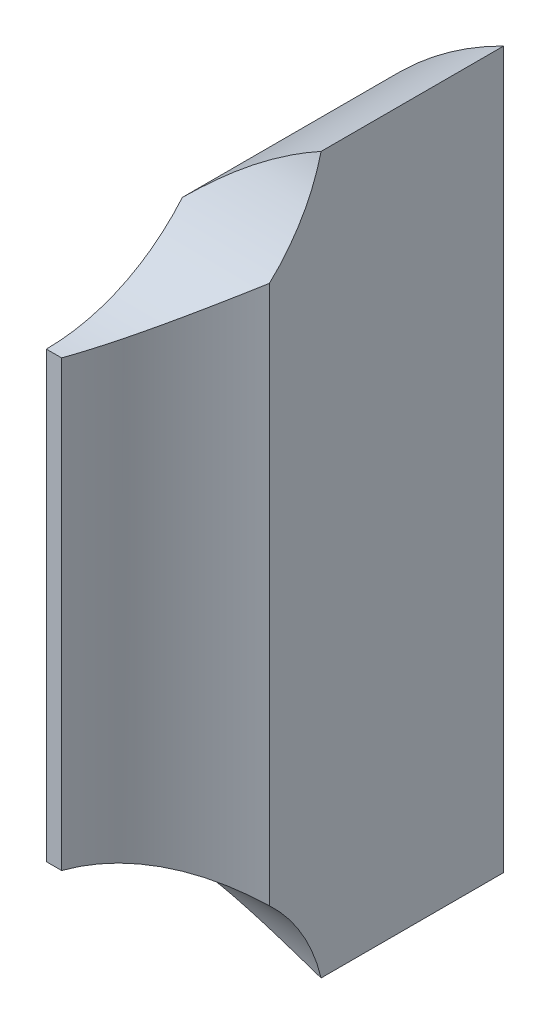
ISO-10303-21;
HEADER;
FILE_DESCRIPTION(('STEP AP214'),'2;1');
FILE_NAME('part.step','',(''),(''),'','','');
FILE_SCHEMA(('AUTOMOTIVE_DESIGN { 1 0 10303 214 1 1 1 1 }'));
ENDSEC;
DATA;
#1=APPLICATION_CONTEXT('core data for automotive mechanical design processes');
#2=APPLICATION_PROTOCOL_DEFINITION('international standard','automotive_design',2000,#1);
#3=PRODUCT_CONTEXT('',#1,'mechanical');
#4=PRODUCT('Part','Part','',(#3));
#5=PRODUCT_RELATED_PRODUCT_CATEGORY('part','',(#4));
#6=PRODUCT_DEFINITION_FORMATION('','',#4);
#7=PRODUCT_DEFINITION_CONTEXT('part definition',#1,'design');
#8=PRODUCT_DEFINITION('design','',#6,#7);
#9=PRODUCT_DEFINITION_SHAPE('','',#8);
#10=(LENGTH_UNIT() NAMED_UNIT(*) SI_UNIT(.MILLI.,.METRE.));
#11=(NAMED_UNIT(*) PLANE_ANGLE_UNIT() SI_UNIT($,.RADIAN.));
#12=(NAMED_UNIT(*) SI_UNIT($,.STERADIAN.) SOLID_ANGLE_UNIT());
#13=UNCERTAINTY_MEASURE_WITH_UNIT(LENGTH_MEASURE(1.E-05),#10,'distance_accuracy_value','');
#14=(GEOMETRIC_REPRESENTATION_CONTEXT(3) GLOBAL_UNCERTAINTY_ASSIGNED_CONTEXT((#13)) GLOBAL_UNIT_ASSIGNED_CONTEXT((#10,
#11,#12)) REPRESENTATION_CONTEXT('',''));
#15=CARTESIAN_POINT('',(0.,0.,0.));
#16=DIRECTION('',(0.,0.,1.));
#17=DIRECTION('',(1.,0.,0.));
#18=AXIS2_PLACEMENT_3D('',#15,#16,#17);
#19=CARTESIAN_POINT('',(-0.9525,-103.07574,-15.3797));
#20=DIRECTION('',(0.,1.,0.));
#21=DIRECTION('',(0.,0.,-1.));
#22=AXIS2_PLACEMENT_3D('',#19,#20,#21);
#23=CYLINDRICAL_SURFACE('',#22,19.05);
#24=CARTESIAN_POINT('',(-18.9130122421383,-15.875,-21.7297000000001));
#25=CARTESIAN_POINT('',(-18.8811903085846,-15.8749565257701,-21.8197073793476));
#26=CARTESIAN_POINT('',(-18.8486910774269,-15.8758817859889,-21.9094748735233));
#27=CARTESIAN_POINT('',(-18.7823799833486,-15.8796309678191,-22.0884237788564));
#28=CARTESIAN_POINT('',(-18.7485689055275,-15.882453769835,-22.177605504318));
#29=CARTESIAN_POINT('',(-18.6796530652591,-15.8899576811454,-22.3553452657174));
#30=CARTESIAN_POINT('',(-18.6445488551965,-15.8946380051287,-22.4439035491481));
#31=CARTESIAN_POINT('',(-18.5730674405112,-15.9058162758002,-22.620360321333));
#32=CARTESIAN_POINT('',(-18.5366905933085,-15.9123137156807,-22.7082589870506));
#33=CARTESIAN_POINT('',(-18.4626857676108,-15.9270856930541,-22.8833609357504));
#34=CARTESIAN_POINT('',(-18.4250579876532,-15.9353599496729,-22.9705643263825));
#35=CARTESIAN_POINT('',(-18.3485744539755,-15.9536450593197,-23.1442409646096));
#36=CARTESIAN_POINT('',(-18.3097187738075,-15.9636558084912,-23.2307142555465));
#37=CARTESIAN_POINT('',(-18.2308038257921,-15.9853734576285,-23.4028967249284));
#38=CARTESIAN_POINT('',(-18.1907445381315,-15.9970803855282,-23.4886058907646));
#39=CARTESIAN_POINT('',(-18.109447972262,-16.022149988871,-23.6592269865126));
#40=CARTESIAN_POINT('',(-18.0682106101074,-16.0355127825331,-23.7441388590363));
#41=CARTESIAN_POINT('',(-17.9845846712323,-16.0638537553766,-23.913133120116));
#42=CARTESIAN_POINT('',(-17.9421959732239,-16.0788321052469,-23.9972154199984));
#43=CARTESIAN_POINT('',(-17.8562952874208,-16.1103638650926,-24.1645191982283));
#44=CARTESIAN_POINT('',(-17.8127831653231,-16.1269174640271,-24.2477405719725));
#45=CARTESIAN_POINT('',(-17.7246646727195,-16.1615594306812,-24.4132921027716));
#46=CARTESIAN_POINT('',(-17.6800581767721,-16.1796479749323,-24.4956221560863));
#47=CARTESIAN_POINT('',(-17.5897810606403,-16.2173195680827,-24.6593616254006));
#48=CARTESIAN_POINT('',(-17.5441103433419,-16.2369027537476,-24.7407709563661));
#49=CARTESIAN_POINT('',(-17.4517359584641,-16.2775234020796,-24.902640562119));
#50=CARTESIAN_POINT('',(-17.4050322392149,-16.2985609376045,-24.983100789123));
#51=CARTESIAN_POINT('',(-17.3106240321332,-16.3420500442234,-25.1430448085102));
#52=CARTESIAN_POINT('',(-17.2629195529226,-16.3645016031385,-25.2225286092964));
#53=CARTESIAN_POINT('',(-17.1665429421,-16.4107787027458,-25.3804935250299));
#54=CARTESIAN_POINT('',(-17.1178708908745,-16.4346041296064,-25.4589747223914));
#55=CARTESIAN_POINT('',(-17.0195900094295,-16.4835898943191,-25.6149143017133));
#56=CARTESIAN_POINT('',(-16.9699812826543,-16.5087500853117,-25.6923727950318));
#57=CARTESIAN_POINT('',(-16.869853699063,-16.5603672197415,-25.8462551668177));
#58=CARTESIAN_POINT('',(-16.8193348976952,-16.5868240843438,-25.922679107824));
#59=CARTESIAN_POINT('',(-16.7174136095199,-16.6409967564092,-26.0744817528764));
#60=CARTESIAN_POINT('',(-16.6660111403802,-16.6687125387202,-26.1498604777659));
#61=CARTESIAN_POINT('',(-16.562349060684,-16.7253652161715,-26.2995627060482));
#62=CARTESIAN_POINT('',(-16.5100894452958,-16.7543021181967,-26.3738862034884));
#63=CARTESIAN_POINT('',(-16.4047397091269,-16.8133592375,-26.5214686169733));
#64=CARTESIAN_POINT('',(-16.3516495745938,-16.8434794743851,-26.5947275153509));
#65=CARTESIAN_POINT('',(-16.2446655129385,-16.9048654828064,-26.7401719962394));
#66=CARTESIAN_POINT('',(-16.1907715751204,-16.936131269594,-26.8123575644425));
#67=CARTESIAN_POINT('',(-16.0822066799392,-16.9997706093167,-26.955647275926));
#68=CARTESIAN_POINT('',(-16.0275357254176,-17.0321441582014,-27.0267514231591));
#69=CARTESIAN_POINT('',(-15.9174436269496,-17.0979612873976,-27.1678707970239));
#70=CARTESIAN_POINT('',(-15.8620225084752,-17.1314048314294,-27.2378860604562));
#71=CARTESIAN_POINT('',(-15.7504561019691,-17.1993246500139,-27.3768218312904));
#72=CARTESIAN_POINT('',(-15.6943108592628,-17.2338008601055,-27.4457424066156));
#73=CARTESIAN_POINT('',(-15.5813197112552,-17.3037554290029,-27.5824865698752));
#74=CARTESIAN_POINT('',(-15.5244738331652,-17.3392337489575,-27.6503102001775));
#75=CARTESIAN_POINT('',(-15.4101037389161,-17.411162603415,-27.7848598179297));
#76=CARTESIAN_POINT('',(-15.3525795282241,-17.4476131300854,-27.8515858142155));
#77=CARTESIAN_POINT('',(-15.2368748019826,-17.5214564534876,-27.9839398789271));
#78=CARTESIAN_POINT('',(-15.1786942781031,-17.5588492621864,-28.0495679333914));
#79=CARTESIAN_POINT('',(-15.0616986782519,-17.6345472229249,-28.1797261772827));
#80=CARTESIAN_POINT('',(-15.002883587174,-17.6728523967103,-28.2442563404791));
#81=CARTESIAN_POINT('',(-14.8846403188259,-17.7503451656461,-28.372219206654));
#82=CARTESIAN_POINT('',(-14.8252121258389,-17.7895327834485,-28.4356518813863));
#83=CARTESIAN_POINT('',(-14.705763838086,-17.8687605400325,-28.5614205009087));
#84=CARTESIAN_POINT('',(-14.6457437323743,-17.9088006945953,-28.6237564253578));
#85=CARTESIAN_POINT('',(-14.5251324986375,-17.9897035847125,-28.7473326107621));
#86=CARTESIAN_POINT('',(-14.4645413691049,-18.0305663224391,-28.8085728688231));
#87=CARTESIAN_POINT('',(-14.3428087433889,-18.113084620717,-28.9299590376117));
#88=CARTESIAN_POINT('',(-14.2816672591563,-18.1547401640746,-28.990104972017));
#89=CARTESIAN_POINT('',(-14.1588538200501,-18.2388138229969,-29.1093045571513));
#90=CARTESIAN_POINT('',(-14.0971818920518,-18.2812319000447,-29.1683582627467));
#91=CARTESIAN_POINT('',(-13.9733260767724,-18.3668061657855,-29.2853767668838));
#92=CARTESIAN_POINT('',(-13.9111422129951,-18.4099623206892,-29.3433416150201));
#93=CARTESIAN_POINT('',(-13.7862797439973,-18.4969910752837,-29.4581868632616));
#94=CARTESIAN_POINT('',(-13.7236011496527,-18.5408636592476,-29.5150672871126));
#95=CARTESIAN_POINT('',(-13.5977658424902,-18.6293031946993,-29.6277484502632));
#96=CARTESIAN_POINT('',(-13.5346091314516,-18.6738701436038,-29.6835491935778));
#97=CARTESIAN_POINT('',(-13.4078338505143,-18.7636764511526,-29.7940758373117));
#98=CARTESIAN_POINT('',(-13.3442152765825,-18.8089158156721,-29.8488017283296));
#99=CARTESIAN_POINT('',(-13.2165321013326,-18.9000449751057,-29.957183634436));
#100=CARTESIAN_POINT('',(-13.152467493057,-18.9459347801774,-30.0108396327849));
#101=CARTESIAN_POINT('',(-13.0239077383455,-19.0383428354514,-30.1170867922243));
#102=CARTESIAN_POINT('',(-12.9594125845558,-19.0848610964019,-30.1696779350645));
#103=CARTESIAN_POINT('',(-12.8300066430001,-19.1785041477027,-30.273800594719));
#104=CARTESIAN_POINT('',(-12.7650958496821,-19.2256289461635,-30.3253320973399));
#105=CARTESIAN_POINT('',(-12.6999850092901,-19.2730458172475,-30.3763361547016));
#106=B_SPLINE_CURVE_WITH_KNOTS('',3,(#24,#25,#26,#27,#28,#29,#30,#31,#32,#33,#34,#35,#36,#37,
#38,#39,#40,#41,#42,#43,#44,#45,#46,#47,#48,#49,#50,#51,#52,#53,#54,#55,#56,#57,#58,#59,#60,#61,
#62,#63,#64,#65,#66,#67,#68,#69,#70,#71,#72,#73,#74,#75,#76,#77,#78,#79,#80,#81,#82,#83,#84,#85,
#86,#87,#88,#89,#90,#91,#92,#93,#94,#95,#96,#97,#98,#99,#100,#101,#102,#103,#104,#105),
.UNSPECIFIED.,.F.,.F.,(4,2,2,2,2,2,2,2,2,2,2,2,2,2,2,2,2,2,2,2,2,2,2,2,2,2,2,2,2,2,2,2,2,2,2,2,
2,2,2,2,4),(0.,0.286392426901371,0.572616023479862,0.858718740951261,1.14474174160438,
1.43071956181754,1.71668028409115,2.00264571630182,2.2886315765028,2.57464768172405,
2.8606981393582,3.14678153985418,3.43289114957385,3.71901510279806,4.00513659199418,
4.29123440861882,4.57730081194722,4.86334984459554,5.14939316473261,5.43543809785371,
5.7214877725344,6.00754125695709,6.29359369559218,6.57963644548234,6.8656613770143,
7.15167523468843,7.43768678880847,7.72370197710865,8.00972398924607,8.29575335184787,
8.58178801372538,8.86782343101232,9.15385265201156,9.43986746553786,9.72586922009848,
10.0118647047948,10.2978591257361,10.5838560470405,10.869857439532,11.1558637295909,
11.4418738480667),.UNSPECIFIED.);
#107=CARTESIAN_POINT('',(-18.9130122421383,-15.875,-21.7297));
#108=VERTEX_POINT('',#107);
#109=CARTESIAN_POINT('',(-12.6999999991116,-19.2730649975569,-30.3763374629023));
#110=VERTEX_POINT('',#109);
#111=EDGE_CURVE('E115',#108,#110,#106,.T.);
#112=ORIENTED_EDGE('',*,*,#111,.T.);
#113=DIRECTION('',(0.,1.,0.));
#114=VECTOR('',#113,1.);
#115=CARTESIAN_POINT('',(-12.7,-103.07574,-30.3763244118468));
#116=LINE('',#115,#114);
#117=CARTESIAN_POINT('',(-12.6999999968803,19.2730800463632,-30.3763439893252));
#118=VERTEX_POINT('',#117);
#119=EDGE_CURVE('E102',#110,#118,#116,.T.);
#120=ORIENTED_EDGE('',*,*,#119,.T.);
#121=CARTESIAN_POINT('',(-12.6999850039393,19.2730458211441,-30.3763361588931));
#122=CARTESIAN_POINT('',(-12.7650958443869,19.2256289500116,-30.3253321015254));
#123=CARTESIAN_POINT('',(-12.8300066377604,19.1785041515024,-30.2738005988977));
#124=CARTESIAN_POINT('',(-12.9594125794268,19.0848611001051,-30.1696779392286));
#125=CARTESIAN_POINT('',(-13.0239077332719,19.0383428391064,-30.1170867963804));
#126=CARTESIAN_POINT('',(-13.1524674880939,18.9459347837365,-30.0108396369236));
#127=CARTESIAN_POINT('',(-13.2165320964246,18.9000449786169,-29.9571836385654));
#128=CARTESIAN_POINT('',(-13.3442152717845,18.8089158190879,-29.848801732439));
#129=CARTESIAN_POINT('',(-13.4078338457712,18.7636764545209,-29.7940758414104));
#130=CARTESIAN_POINT('',(-13.5346091268181,18.6738701468775,-29.6835491976539));
#131=CARTESIAN_POINT('',(-13.5977658379114,18.6293031979258,-29.6277484543272));
#132=CARTESIAN_POINT('',(-13.723601145183,18.5408636623803,-29.5150672911512));
#133=CARTESIAN_POINT('',(-13.7862797395821,18.4969910783697,-29.4581868672868));
#134=CARTESIAN_POINT('',(-13.9111422086884,18.4099623236822,-29.3433416190172));
#135=CARTESIAN_POINT('',(-13.9733260725198,18.3668061687323,-29.285376770866));
#136=CARTESIAN_POINT('',(-14.0971818879071,18.2812319028995,-29.168358266698));
#137=CARTESIAN_POINT('',(-14.1588538159593,18.238813825806,-29.1093045610865));
#138=CARTESIAN_POINT('',(-14.2816672551729,18.1547401667926,-28.9901049759185));
#139=CARTESIAN_POINT('',(-14.342808739459,18.1130846233898,-28.9299590414955));
#140=CARTESIAN_POINT('',(-14.4645413652818,18.0305663250217,-28.8085728726702));
#141=CARTESIAN_POINT('',(-14.5251324948676,17.9897035872503,-28.7473326145902));
#142=CARTESIAN_POINT('',(-14.6457437287104,17.9088006970438,-28.6237564291463));
#143=CARTESIAN_POINT('',(-14.705763834475,17.8687605424367,-28.5614205046766));
#144=CARTESIAN_POINT('',(-14.8252121223332,17.7895327857647,-28.4356518851117));
#145=CARTESIAN_POINT('',(-14.8846403153726,17.7503451679185,-28.3722192103574));
#146=CARTESIAN_POINT('',(-15.0028835838252,17.6728523988958,-28.2442563441369));
#147=CARTESIAN_POINT('',(-15.0616986749552,17.6345472250673,-28.179726180917));
#148=CARTESIAN_POINT('',(-15.17869427491,17.5588492642432,-28.0495679369771));
#149=CARTESIAN_POINT('',(-15.236874798841,17.5214564555019,-27.9839398824879));
#150=CARTESIAN_POINT('',(-15.3525795251851,17.4476131320156,-27.8515858177247));
#151=CARTESIAN_POINT('',(-15.4101037359282,17.4111626053036,-27.7848598214123));
#152=CARTESIAN_POINT('',(-15.5244738302788,17.3392337507635,-27.6503102036056));
#153=CARTESIAN_POINT('',(-15.5813197084193,17.303755430768,-27.5824865732752));
#154=CARTESIAN_POINT('',(-15.6943108565274,17.2338008617898,-27.4457424099581));
#155=CARTESIAN_POINT('',(-15.7504560992836,17.1993246516584,-27.3768218346033));
#156=CARTESIAN_POINT('',(-15.8620225058889,17.1314048329947,-27.2378860637085));
#157=CARTESIAN_POINT('',(-15.9174436244126,17.0979612889238,-27.167870800245));
#158=CARTESIAN_POINT('',(-16.0275357229786,17.0321441596504,-27.0267514263164));
#159=CARTESIAN_POINT('',(-16.0822066775489,16.9997706107274,-26.9556472790506));
#160=CARTESIAN_POINT('',(-16.1907715728268,16.9361312709293,-26.8123575675));
#161=CARTESIAN_POINT('',(-16.2446655106929,16.9048654841045,-26.7401719992626));
#162=CARTESIAN_POINT('',(-16.3516495724435,16.8434794756098,-26.5947275183039));
#163=CARTESIAN_POINT('',(-16.4047397070238,16.8133592386886,-26.5214686198905));
#164=CARTESIAN_POINT('',(-16.5100894432865,16.754302119314,-26.3738862063322));
#165=CARTESIAN_POINT('',(-16.5623490587211,16.7253652172538,-26.2995627088545));
#166=CARTESIAN_POINT('',(-16.6660111385095,16.6687125397335,-26.1498604804957));
#167=CARTESIAN_POINT('',(-16.7174136076948,16.6409967573887,-26.0744817555672));
#168=CARTESIAN_POINT('',(-16.8193348959605,16.5868240852569,-25.9226791104352));
#169=CARTESIAN_POINT('',(-16.8698536973731,16.5603672206221,-25.8462551693883));
#170=CARTESIAN_POINT('',(-16.9699812810529,16.5087500861285,-25.6923727975196));
#171=CARTESIAN_POINT('',(-17.0195900078718,16.4835898951046,-25.6149143041591));
#172=CARTESIAN_POINT('',(-17.1178708894034,16.434604130331,-25.4589747247513));
#173=CARTESIAN_POINT('',(-17.1665429406717,16.4107787034406,-25.3804935273461));
#174=CARTESIAN_POINT('',(-17.2629195515788,16.3645016037753,-25.2225286115237));
#175=CARTESIAN_POINT('',(-17.3106240308312,16.3420500448319,-25.1430448106922));
#176=CARTESIAN_POINT('',(-17.4050322379954,16.298560938158,-24.9831007912128));
#177=CARTESIAN_POINT('',(-17.4517359572853,16.2775234026064,-24.902640564162));
#178=CARTESIAN_POINT('',(-17.5441103422433,16.2369027542227,-24.7407709583138));
#179=CARTESIAN_POINT('',(-17.5897810595813,16.2173195685327,-24.6593616273));
#180=CARTESIAN_POINT('',(-17.6800581757908,16.179647975334,-24.4956221578874));
#181=CARTESIAN_POINT('',(-17.7246646717766,16.1615594310596,-24.4132921045229));
#182=CARTESIAN_POINT('',(-17.8127831644556,16.1269174643607,-24.2477405736226));
#183=CARTESIAN_POINT('',(-17.8562952865903,16.1103638654048,-24.1645191998271));
#184=CARTESIAN_POINT('',(-17.942195972466,16.078832105518,-23.9972154214933));
#185=CARTESIAN_POINT('',(-17.9845846705101,16.0638537556282,-23.9131331215581));
#186=CARTESIAN_POINT('',(-18.0682106094551,16.0355127827476,-23.7441388603719));
#187=CARTESIAN_POINT('',(-18.1094479716439,16.0221499890679,-23.6592269877942));
#188=CARTESIAN_POINT('',(-18.1907445375804,15.997080385692,-23.488605891937));
#189=CARTESIAN_POINT('',(-18.2308038252737,15.9853734577768,-23.4028967260455));
#190=CARTESIAN_POINT('',(-18.309718773353,15.9636558086107,-23.230714256552));
#191=CARTESIAN_POINT('',(-18.3485744535522,15.9536450594258,-23.1442409655587));
#192=CARTESIAN_POINT('',(-18.4250579872907,15.9353599497546,-22.9705643272176));
#193=CARTESIAN_POINT('',(-18.4626857672779,15.9270856931247,-22.883360936528));
#194=CARTESIAN_POINT('',(-18.5366905930332,15.9123137157315,-22.7082589877121));
#195=CARTESIAN_POINT('',(-18.5730674402638,15.9058162758421,-22.6203603219359));
#196=CARTESIAN_POINT('',(-18.6445488550033,15.8946380051555,-22.4439035496329));
#197=CARTESIAN_POINT('',(-18.6796530650921,15.8899576811659,-22.3553452661426));
#198=CARTESIAN_POINT('',(-18.7485689054112,15.8824537698452,-22.1776055046232));
#199=CARTESIAN_POINT('',(-18.7823799832568,15.8796309678255,-22.0884237791011));
#200=CARTESIAN_POINT('',(-18.8486910773824,15.8758817859901,-21.9094748736462));
#201=CARTESIAN_POINT('',(-18.8811903085628,15.87495652577,-21.8197073794092));
#202=CARTESIAN_POINT('',(-18.9130122421383,15.875,-21.7297000000001));
#203=B_SPLINE_CURVE_WITH_KNOTS('',3,(#121,#122,#123,#124,#125,#126,#127,#128,#129,#130,#131,
#132,#133,#134,#135,#136,#137,#138,#139,#140,#141,#142,#143,#144,#145,#146,#147,#148,#149,#150,
#151,#152,#153,#154,#155,#156,#157,#158,#159,#160,#161,#162,#163,#164,#165,#166,#167,#168,#169,
#170,#171,#172,#173,#174,#175,#176,#177,#178,#179,#180,#181,#182,#183,#184,#185,#186,#187,#188,
#189,#190,#191,#192,#193,#194,#195,#196,#197,#198,#199,#200,#201,#202),.UNSPECIFIED.,.F.,.F.,(4,
2,2,2,2,2,2,2,2,2,2,2,2,2,2,2,2,2,2,2,2,2,2,2,2,2,2,2,2,2,2,2,2,2,2,2,2,2,2,2,4),(0.,
0.286010118671753,0.572016408926673,0.858017801614147,1.14401472311451,1.4300091442517,
1.71600462914377,2.00200638390004,2.28802119762184,2.57405041881673,2.86008583629949,
3.14612049837294,3.43214986117075,3.71817187350416,4.00418706200031,4.29019861631622,
4.57621247418611,4.86223740591365,5.14828015599946,5.43433259483036,5.72038607944897,
6.0064357543256,6.29248068764264,6.57852400797556,6.86457304081964,7.15063944434368,
7.43673726116391,7.72285875055584,8.00898270397606,8.2950923138918,8.58117571458391,
8.86722617241417,9.15324227783147,9.43922813822843,9.72519357063499,10.0111542931044,
10.2971321135133,10.5831551143622,10.8692578320293,11.1554814288037,11.4418738559012),.UNSPECIFIED.);
#204=CARTESIAN_POINT('',(-18.9130122421383,15.875,-21.7297));
#205=VERTEX_POINT('',#204);
#206=EDGE_CURVE('E111',#118,#205,#203,.T.);
#207=ORIENTED_EDGE('',*,*,#206,.T.);
#208=DIRECTION('',(0.,1.,0.));
#209=VECTOR('',#208,1.);
#210=CARTESIAN_POINT('',(-18.9130122421383,-103.07574,-21.7297));
#211=LINE('',#210,#209);
#212=EDGE_CURVE('E284',#108,#205,#211,.T.);
#213=ORIENTED_EDGE('',*,*,#212,.F.);
#214=EDGE_LOOP('',(#112,#120,#207,#213));
#215=FACE_BOUND('',#214,.T.);
#216=ADVANCED_FACE('F38',(#215),#23,.F.);
#217=CARTESIAN_POINT('',(-20.0025,0.,0.));
#218=DIRECTION('',(-1.,0.,0.));
#219=DIRECTION('',(0.,0.,1.));
#220=AXIS2_PLACEMENT_3D('',#217,#218,#219);
#221=PLANE('',#220);
#222=CARTESIAN_POINT('',(-20.0025,-28.575,-21.7297));
#223=DIRECTION('',(-1.,0.,0.));
#224=DIRECTION('',(0.,0.,1.));
#225=AXIS2_PLACEMENT_3D('',#222,#223,#224);
#226=CIRCLE('',#225,12.7);
#227=CARTESIAN_POINT('',(-20.0025,-20.4066316144381,-31.4542955143519));
#228=VERTEX_POINT('',#227);
#229=CARTESIAN_POINT('',(-20.0025,-15.875,-21.7297));
#230=VERTEX_POINT('',#229);
#231=EDGE_CURVE('E289',#228,#230,#226,.F.);
#232=ORIENTED_EDGE('',*,*,#231,.T.);
#233=DIRECTION('',(0.,1.,0.));
#234=VECTOR('',#233,1.);
#235=CARTESIAN_POINT('',(-20.0025,0.,-21.7297));
#236=LINE('',#235,#234);
#237=CARTESIAN_POINT('',(-20.0025,15.875,-21.7297));
#238=VERTEX_POINT('',#237);
#239=EDGE_CURVE('E50',#230,#238,#236,.T.);
#240=ORIENTED_EDGE('',*,*,#239,.T.);
#241=CARTESIAN_POINT('',(-20.0025,28.575,-21.7297));
#242=DIRECTION('',(-1.,0.,0.));
#243=DIRECTION('',(0.,0.,1.));
#244=AXIS2_PLACEMENT_3D('',#241,#242,#243);
#245=CIRCLE('',#244,12.7);
#246=CARTESIAN_POINT('',(-20.0025,20.4066317338559,-31.4542956146592));
#247=VERTEX_POINT('',#246);
#248=EDGE_CURVE('E315',#238,#247,#245,.F.);
#249=ORIENTED_EDGE('',*,*,#248,.T.);
#250=DIRECTION('',(0.,0.,1.));
#251=VECTOR('',#250,1.);
#252=CARTESIAN_POINT('',(-20.0025,20.4066317345612,-47.1297));
#253=LINE('',#252,#251);
#254=CARTESIAN_POINT('',(-20.0025,20.4066317345612,-47.1297));
#255=VERTEX_POINT('',#254);
#256=EDGE_CURVE('E310',#255,#247,#253,.T.);
#257=ORIENTED_EDGE('',*,*,#256,.F.);
#258=DIRECTION('',(0.,-1.,0.));
#259=VECTOR('',#258,1.);
#260=CARTESIAN_POINT('',(-20.0025,0.,-47.1297));
#261=LINE('',#260,#259);
#262=CARTESIAN_POINT('',(-20.0025,-20.4066317345612,-47.1297));
#263=VERTEX_POINT('',#262);
#264=EDGE_CURVE('E65',#255,#263,#261,.T.);
#265=ORIENTED_EDGE('',*,*,#264,.T.);
#266=DIRECTION('',(0.,0.,1.));
#267=VECTOR('',#266,1.);
#268=CARTESIAN_POINT('',(-20.0025,-20.4066317345612,-47.1297));
#269=LINE('',#268,#267);
#270=EDGE_CURVE('E297',#228,#263,#269,.F.);
#271=ORIENTED_EDGE('',*,*,#270,.F.);
#272=EDGE_LOOP('',(#232,#240,#249,#257,#265,#271));
#273=FACE_BOUND('',#272,.T.);
#274=ADVANCED_FACE('F153',(#273),#221,.T.);
#275=CARTESIAN_POINT('',(0.,0.,-47.1297));
#276=DIRECTION('',(0.,0.,1.));
#277=DIRECTION('',(1.,0.,0.));
#278=AXIS2_PLACEMENT_3D('',#275,#276,#277);
#279=CYLINDRICAL_SURFACE('',#278,28.575);
#280=DIRECTION('',(0.,0.,1.));
#281=VECTOR('',#280,1.);
#282=CARTESIAN_POINT('',(-12.7,-25.5976683508479,-47.1297));
#283=LINE('',#282,#281);
#284=CARTESIAN_POINT('',(-12.6999983433171,-25.5976757493575,-34.0757852865957));
#285=VERTEX_POINT('',#284);
#286=CARTESIAN_POINT('',(-12.7,-25.5976683508479,-47.1297));
#287=VERTEX_POINT('',#286);
#288=EDGE_CURVE('E278',#285,#287,#283,.F.);
#289=ORIENTED_EDGE('',*,*,#288,.F.);
#290=CARTESIAN_POINT('',(-12.6999966866658,-25.5976699947217,-34.0757953031578));
#291=CARTESIAN_POINT('',(-12.7700673955808,-25.5629052373995,-34.0674117354128));
#292=CARTESIAN_POINT('',(-12.8399740198672,-25.5278632750886,-34.0588053518139));
#293=CARTESIAN_POINT('',(-12.9794503949056,-25.4572308494675,-34.0411315315577));
#294=CARTESIAN_POINT('',(-13.0490201481879,-25.4216403902853,-34.032064098369));
#295=CARTESIAN_POINT('',(-13.1878150607897,-25.3499163931831,-34.0134526413856));
#296=CARTESIAN_POINT('',(-13.2570402204597,-25.3137828558156,-34.0039086180757));
#297=CARTESIAN_POINT('',(-13.395138290379,-25.2409783504881,-33.9843284553251));
#298=CARTESIAN_POINT('',(-13.4640111973853,-25.2043073775922,-33.9742923113627));
#299=CARTESIAN_POINT('',(-13.6013972219689,-25.130433776938,-33.9537123826932));
#300=CARTESIAN_POINT('',(-13.6699103311535,-25.0932311368524,-33.9431685862021));
#301=CARTESIAN_POINT('',(-13.8065688235992,-25.0183004028885,-33.9215579045911));
#302=CARTESIAN_POINT('',(-13.8747141943485,-24.9805722912861,-33.9104910017965));
#303=CARTESIAN_POINT('',(-14.0106270911629,-24.9045982646071,-33.8878163290583));
#304=CARTESIAN_POINT('',(-14.0783946097764,-24.8663523393696,-33.8762085484901));
#305=CARTESIAN_POINT('',(-14.2135413580152,-24.7893508496336,-33.8524344198259));
#306=CARTESIAN_POINT('',(-14.2809205863839,-24.7505952834874,-33.8402680699237));
#307=CARTESIAN_POINT('',(-14.4152804896728,-24.6725829206965,-33.8153591026996));
#308=CARTESIAN_POINT('',(-14.4822611678036,-24.6333261280976,-33.8026164900274));
#309=CARTESIAN_POINT('',(-14.6158138892038,-24.5543199629359,-33.7765372999542));
#310=CARTESIAN_POINT('',(-14.6823859382095,-24.5145705973115,-33.7632007309129));
#311=CARTESIAN_POINT('',(-14.8151115078261,-24.4345881740211,-33.7359159346904));
#312=CARTESIAN_POINT('',(-14.8812650345307,-24.3943551234222,-33.7219677164383));
#313=CARTESIAN_POINT('',(-15.0131438569703,-24.3134144521573,-33.6934419272425));
#314=CARTESIAN_POINT('',(-15.0788691567481,-24.2727068359816,-33.6788643622504));
#315=CARTESIAN_POINT('',(-15.2098820215523,-24.1908263829141,-33.6490622051115));
#316=CARTESIAN_POINT('',(-15.2751695859092,-24.1496535453108,-33.6338376119755));
#317=CARTESIAN_POINT('',(-15.4052976647977,-24.0668522310133,-33.6027236667541));
#318=CARTESIAN_POINT('',(-15.4701381710188,-24.0252237458859,-33.5868343023498));
#319=CARTESIAN_POINT('',(-15.5993630048867,-23.9415209495842,-33.5543733311465));
#320=CARTESIAN_POINT('',(-15.6637473137904,-23.8994466202673,-33.5378016965044));
#321=CARTESIAN_POINT('',(-15.7920488551595,-23.8148634698669,-33.503958158672));
#322=CARTESIAN_POINT('',(-15.8559660680917,-23.7723546307891,-33.4866862263917));
#323=CARTESIAN_POINT('',(-15.9833204309315,-23.686915646293,-33.4514232573067));
#324=CARTESIAN_POINT('',(-16.0467575728232,-23.6439854938674,-33.4334322085263));
#325=CARTESIAN_POINT('',(-16.1731390425968,-23.5577174636705,-33.3967124609464));
#326=CARTESIAN_POINT('',(-16.2360833717545,-23.5143795869556,-33.3779837640575));
#327=CARTESIAN_POINT('',(-16.3614667690341,-23.4273100377136,-33.3397701103356));
#328=CARTESIAN_POINT('',(-16.4239058442485,-23.3835783707327,-33.3202851641406));
#329=CARTESIAN_POINT('',(-16.5482666115706,-23.2957355010856,-33.2805404260054));
#330=CARTESIAN_POINT('',(-16.6101883127151,-23.251624305076,-33.2602806476336));
#331=CARTESIAN_POINT('',(-16.7335025352611,-23.163036963047,-33.2189676591022));
#332=CARTESIAN_POINT('',(-16.7948950633531,-23.1185608216555,-33.1979144589921));
#333=CARTESIAN_POINT('',(-16.91713947592,-23.0292584900179,-33.1549960534695));
#334=CARTESIAN_POINT('',(-16.977991360008,-22.9844322995213,-33.133130847476));
#335=CARTESIAN_POINT('',(-17.0991433522474,-22.8944450821541,-33.0885698464262));
#336=CARTESIAN_POINT('',(-17.159443447742,-22.8492840476458,-33.0658740323771));
#337=CARTESIAN_POINT('',(-17.2794810183735,-22.7586426934067,-33.019633329747));
#338=CARTESIAN_POINT('',(-17.3392184635515,-22.7131623568969,-32.9960883962725));
#339=CARTESIAN_POINT('',(-17.4581179748795,-22.6218999766949,-32.9481315803594));
#340=CARTESIAN_POINT('',(-17.5172800089383,-22.5761179164115,-32.9237196499168));
#341=CARTESIAN_POINT('',(-17.6350136204004,-22.4842721462228,-32.8740115728717));
#342=CARTESIAN_POINT('',(-17.6935851838362,-22.4382084296962,-32.8487154054156));
#343=CARTESIAN_POINT('',(-17.8101231115439,-22.3458199428894,-32.7972217178418));
#344=CARTESIAN_POINT('',(-17.8680894762469,-22.2994951727951,-32.7710241983663));
#345=CARTESIAN_POINT('',(-17.9834027407896,-22.2066055979056,-32.7177106609667));
#346=CARTESIAN_POINT('',(-18.0407496496359,-22.1600407966148,-32.6905946564207));
#347=CARTESIAN_POINT('',(-18.1548102226902,-22.0666925841003,-32.6354270157963));
#348=CARTESIAN_POINT('',(-18.211523898032,-22.0199091767408,-32.6073753962031));
#349=CARTESIAN_POINT('',(-18.3243047138031,-21.9261455682145,-32.5503194045325));
#350=CARTESIAN_POINT('',(-18.3803718603909,-21.8791653689281,-32.5213150415407));
#351=CARTESIAN_POINT('',(-18.4918468152839,-21.7850303746467,-32.4623364398029));
#352=CARTESIAN_POINT('',(-18.5472546169882,-21.7378755779099,-32.4323621913582));
#353=CARTESIAN_POINT('',(-18.6573985896934,-21.6434139346272,-32.371426756793));
#354=CARTESIAN_POINT('',(-18.7121347328423,-21.596107081878,-32.3404655299351));
#355=CARTESIAN_POINT('',(-18.8209231174513,-21.5013646352256,-32.2775391399044));
#356=CARTESIAN_POINT('',(-18.8749753057618,-21.453929031661,-32.2455738993747));
#357=CARTESIAN_POINT('',(-18.9823810053821,-21.3589553973413,-32.18062602749));
#358=CARTESIAN_POINT('',(-19.0357344742037,-21.3114173605601,-32.1476433346705));
#359=CARTESIAN_POINT('',(-19.141726900582,-21.2162670694291,-32.0806485169081));
#360=CARTESIAN_POINT('',(-19.1943658418807,-21.1686548134178,-32.0466363685979));
#361=CARTESIAN_POINT('',(-19.2989139571478,-21.0733847954091,-31.9775705091465));
#362=CARTESIAN_POINT('',(-19.3508231333941,-21.0257270335543,-31.9425168012574));
#363=CARTESIAN_POINT('',(-19.4538971018451,-20.9303951355024,-31.8713557295101));
#364=CARTESIAN_POINT('',(-19.5050619061789,-20.8827209995851,-31.8352483828491));
#365=CARTESIAN_POINT('',(-19.6066331389742,-20.7873859200634,-31.7619679589802));
#366=CARTESIAN_POINT('',(-19.6570395798924,-20.739724976255,-31.7247948993065));
#367=CARTESIAN_POINT('',(-19.7570807184687,-20.6444461656964,-31.6493709400521));
#368=CARTESIAN_POINT('',(-19.806715418519,-20.5968282988132,-31.6111200438132));
#369=CARTESIAN_POINT('',(-19.9052003305958,-20.5016661691756,-31.5335285052944));
#370=CARTESIAN_POINT('',(-19.9540505236627,-20.4541219082251,-31.4941878367396));
#371=CARTESIAN_POINT('',(-20.0025008126625,-20.4066309379926,-31.4542973067295));
#372=B_SPLINE_CURVE_WITH_KNOTS('',3,(#290,#291,#292,#293,#294,#295,#296,#297,#298,#299,#300,
#301,#302,#303,#304,#305,#306,#307,#308,#309,#310,#311,#312,#313,#314,#315,#316,#317,#318,#319,
#320,#321,#322,#323,#324,#325,#326,#327,#328,#329,#330,#331,#332,#333,#334,#335,#336,#337,#338,
#339,#340,#341,#342,#343,#344,#345,#346,#347,#348,#349,#350,#351,#352,#353,#354,#355,#356,#357,
#358,#359,#360,#361,#362,#363,#364,#365,#366,#367,#368,#369,#370,#371),.UNSPECIFIED.,.F.,.F.,(4,
2,2,2,2,2,2,2,2,2,2,2,2,2,2,2,2,2,2,2,2,2,2,2,2,2,2,2,2,2,2,2,2,2,2,2,2,2,2,2,4),(0.,
0.236005502034785,0.472009228749425,0.708012715394345,0.944018370922807,1.18002950745262,
1.41604862397258,1.65207237855484,1.88809689641613,2.124119510283,2.36013880327443,
2.59615465189405,2.83216826906548,3.06818224713953,3.30420060079062,3.54022859581505,
3.7762664053744,4.0123081474115,4.24834927809721,4.48438708963432,4.72042076972315,
4.95645146117129,5.19248232149157,5.42851858231851,5.66456734086792,5.9006291894196,
6.13669660897526,6.3727638603435,6.60882767478066,6.84488733208305,7.08094473889602,
7.31700450695996,7.55307403098165,7.78916178847198,8.02526383612624,8.26137124700746,
8.49747792078435,8.73358074305773,8.96967968294734,9.20577789088581,9.44188179620405),.UNSPECIFIED.);
#373=EDGE_CURVE('E279',#285,#228,#372,.T.);
#374=ORIENTED_EDGE('',*,*,#373,.T.);
#375=ORIENTED_EDGE('',*,*,#270,.T.);
#376=CARTESIAN_POINT('',(0.,0.,-47.1297));
#377=DIRECTION('',(0.,0.,1.));
#378=DIRECTION('',(-1.,0.,0.));
#379=AXIS2_PLACEMENT_3D('',#376,#377,#378);
#380=CIRCLE('',#379,28.575);
#381=EDGE_CURVE('E281',#263,#287,#380,.T.);
#382=ORIENTED_EDGE('',*,*,#381,.T.);
#383=EDGE_LOOP('',(#289,#374,#375,#382));
#384=FACE_BOUND('',#383,.T.);
#385=ADVANCED_FACE('F147',(#384),#279,.T.);
#386=CARTESIAN_POINT('',(0.,0.,-47.1297));
#387=DIRECTION('',(0.,0.,1.));
#388=DIRECTION('',(1.,0.,0.));
#389=AXIS2_PLACEMENT_3D('',#386,#387,#388);
#390=CYLINDRICAL_SURFACE('',#389,28.575);
#391=DIRECTION('',(0.,0.,1.));
#392=VECTOR('',#391,1.);
#393=CARTESIAN_POINT('',(-12.7,25.5976683508479,-47.1297));
#394=LINE('',#393,#392);
#395=CARTESIAN_POINT('',(-12.7,25.5976683508479,-47.1297));
#396=VERTEX_POINT('',#395);
#397=CARTESIAN_POINT('',(-12.6999991783522,25.5976785389109,-34.0757802041835));
#398=VERTEX_POINT('',#397);
#399=EDGE_CURVE('E58',#396,#398,#394,.T.);
#400=ORIENTED_EDGE('',*,*,#399,.F.);
#401=CARTESIAN_POINT('',(0.,0.,-47.1297));
#402=DIRECTION('',(0.,0.,1.));
#403=DIRECTION('',(1.,0.,0.));
#404=AXIS2_PLACEMENT_3D('',#401,#402,#403);
#405=CIRCLE('',#404,28.575);
#406=EDGE_CURVE('E294',#396,#255,#405,.T.);
#407=ORIENTED_EDGE('',*,*,#406,.T.);
#408=ORIENTED_EDGE('',*,*,#256,.T.);
#409=CARTESIAN_POINT('',(-20.0025007557052,20.4066309938219,-31.4542974135568));
#410=CARTESIAN_POINT('',(-19.9540503483137,20.4541220798792,-31.4941881406975));
#411=CARTESIAN_POINT('',(-19.9052000240582,20.5016664674604,-31.5335289789757));
#412=CARTESIAN_POINT('',(-19.8067148917738,20.5968288056979,-31.6111207600573));
#413=CARTESIAN_POINT('',(-19.7570801037199,20.6444467544533,-31.6493717305429));
#414=CARTESIAN_POINT('',(-19.6570388137572,20.7397257026464,-31.7247957722347));
#415=CARTESIAN_POINT('',(-19.6066323100722,20.787386702183,-31.7619688409591));
#416=CARTESIAN_POINT('',(-19.5050609585213,20.88272188495,-31.8352492484733));
#417=CARTESIAN_POINT('',(-19.4538960984358,20.9303960683807,-31.8713565700624));
#418=CARTESIAN_POINT('',(-19.3508220066932,21.0257280707897,-31.9425175881973));
#419=CARTESIAN_POINT('',(-19.2989127627857,21.0733858894853,-31.9775712673738));
#420=CARTESIAN_POINT('',(-19.1943644818256,21.1686560470675,-32.0466370984753));
#421=CARTESIAN_POINT('',(-19.1417254420358,21.2162683857826,-32.0806492464921));
#422=CARTESIAN_POINT('',(-19.0357327673069,21.3114188858513,-32.147644119547));
#423=CARTESIAN_POINT('',(-18.9823791478478,21.3589570487869,-32.1806268668336));
#424=CARTESIAN_POINT('',(-18.8749730868111,21.453930984853,-32.2455749481436));
#425=CARTESIAN_POINT('',(-18.8209206867185,21.5013667638686,-32.2775403421785));
#426=CARTESIAN_POINT('',(-18.712131925283,21.5961095151986,-32.3404670104117));
#427=CARTESIAN_POINT('',(-18.6573956177216,21.6434164972896,-32.3714283628867));
#428=CARTESIAN_POINT('',(-18.5472514011323,21.7378783220505,-32.432363977315));
#429=CARTESIAN_POINT('',(-18.4918435211015,21.7850331711786,-32.4623382816809));
#430=CARTESIAN_POINT('',(-18.3803684732633,21.8791682144258,-32.5213169436187));
#431=CARTESIAN_POINT('',(-18.3243013128779,21.9261484105032,-32.5503213120958));
#432=CARTESIAN_POINT('',(-18.2115205095357,22.019911979034,-32.607377277188));
#433=CARTESIAN_POINT('',(-18.1548068609305,22.0666953497628,-32.6354288654701));
#434=CARTESIAN_POINT('',(-18.0407463575175,22.1600434765456,-32.6905964215107));
#435=CARTESIAN_POINT('',(-17.9833994917885,22.2066082288093,-32.7177123730987));
#436=CARTESIAN_POINT('',(-17.8680863050124,22.2994977136542,-32.7710257977776));
#437=CARTESIAN_POINT('',(-17.8101199748869,22.3458224427032,-32.7972232573835));
#438=CARTESIAN_POINT('',(-17.6935820826396,22.4382108751031,-32.8487168337045));
#439=CARTESIAN_POINT('',(-17.6350105197438,22.4842745781202,-32.8740129492664));
#440=CARTESIAN_POINT('',(-17.517276849746,22.5761203679165,-32.9237209460942));
#441=CARTESIAN_POINT('',(-17.4581147560106,22.6219024610322,-32.9481328473165));
#442=CARTESIAN_POINT('',(-17.3392150673325,22.7131649500294,-32.9960896327568));
#443=CARTESIAN_POINT('',(-17.2794775039069,22.7586453622056,-33.01963456412));
#444=CARTESIAN_POINT('',(-17.1594397592558,22.8492868178555,-33.0658752646661));
#445=CARTESIAN_POINT('',(-17.0991396085304,22.894447878412,-33.0885710795529));
#446=CARTESIAN_POINT('',(-16.9779875693768,22.9844350994978,-33.1331320727074));
#447=CARTESIAN_POINT('',(-16.9171356941619,23.0292612680007,-33.1549972708029));
#448=CARTESIAN_POINT('',(-16.7948913469644,23.118563521239,-33.1979156528037));
#449=CARTESIAN_POINT('',(-16.7334988757714,23.1630396064853,-33.2189688378945));
#450=CARTESIAN_POINT('',(-16.6101847978893,23.251626815572,-33.2602817889156));
#451=CARTESIAN_POINT('',(-16.5482631847637,23.29573793496,-33.2805415451775));
#452=CARTESIAN_POINT('',(-16.4239026072786,23.3835806438504,-33.320286232274));
#453=CARTESIAN_POINT('',(-16.3614636339928,23.4273122267777,-33.3397711497058));
#454=CARTESIAN_POINT('',(-16.2360804368764,23.5143816130034,-33.3779847396879));
#455=CARTESIAN_POINT('',(-16.1731362059257,23.5577194107342,-33.3967134015586));
#456=CARTESIAN_POINT('',(-16.0467549109449,23.6439873001147,-33.4334330732376));
#457=CARTESIAN_POINT('',(-15.9833178454786,23.6869173905755,-33.4514240808956));
#458=CARTESIAN_POINT('',(-15.8559635957057,23.7723562796889,-33.4866869632425));
#459=CARTESIAN_POINT('',(-15.7920464191278,23.8148650850978,-33.5039588494784));
#460=CARTESIAN_POINT('',(-15.6637449060499,23.8994481983068,-33.5378022843901));
#461=CARTESIAN_POINT('',(-15.599360588781,23.9415225238225,-33.5543738617064));
#462=CARTESIAN_POINT('',(-15.4701357619478,24.0252252970592,-33.5868347403693));
#463=CARTESIAN_POINT('',(-15.4052952712586,24.066853763051,-33.6027240697544));
#464=CARTESIAN_POINT('',(-15.2751672498263,24.1496550227612,-33.6338379548261));
#465=CARTESIAN_POINT('',(-15.2098797275547,24.1908278250764,-33.6490625230702));
#466=CARTESIAN_POINT('',(-15.0788669681362,24.2727081953615,-33.6788646396392));
#467=CARTESIAN_POINT('',(-15.013141731782,24.3134157641737,-33.6934421891356));
#468=CARTESIAN_POINT('',(-14.8812630516404,24.3943563327401,-33.7219679534805));
#469=CARTESIAN_POINT('',(-14.8151096038966,24.4345893280998,-33.735916162505));
#470=CARTESIAN_POINT('',(-14.6823842018837,24.514571636905,-33.7632009439713));
#471=CARTESIAN_POINT('',(-14.6158122415718,24.5543209433423,-33.7765375075587));
#472=CARTESIAN_POINT('',(-14.4822597013216,24.6333269899163,-33.8026166878423));
#473=CARTESIAN_POINT('',(-14.4152791156634,24.6725837231345,-33.8153592962028));
#474=CARTESIAN_POINT('',(-14.2809193950362,24.750595970553,-33.8402682532545));
#475=CARTESIAN_POINT('',(-14.2135402568395,24.7893514806862,-33.8524345972719));
#476=CARTESIAN_POINT('',(-14.0783936805581,24.8663528651584,-33.8762087104214));
#477=CARTESIAN_POINT('',(-14.0106262436808,24.9045987410811,-33.8878164812895));
#478=CARTESIAN_POINT('',(-13.8747134955121,24.9805726791896,-33.9104911268748));
#479=CARTESIAN_POINT('',(-13.8065681915924,25.0183007514274,-33.9215580121027));
#480=CARTESIAN_POINT('',(-13.6699098183564,25.0932314160169,-33.9431686526204));
#481=CARTESIAN_POINT('',(-13.6013967614755,25.130434025984,-33.9537124254768));
#482=CARTESIAN_POINT('',(-13.4640108332581,25.2043075719515,-33.9742923075711));
#483=CARTESIAN_POINT('',(-13.3951379702686,25.2409785202116,-33.9843284285286));
#484=CARTESIAN_POINT('',(-13.2570399818723,25.3137829806343,-34.0039085461481));
#485=CARTESIAN_POINT('',(-13.1878148596729,25.3499164976784,-34.0134525472822));
#486=CARTESIAN_POINT('',(-13.0490200175016,25.4216404572534,-34.0320639628775));
#487=CARTESIAN_POINT('',(-12.9794502971536,25.4572308991915,-34.0411313768184));
#488=CARTESIAN_POINT('',(-12.8399739854435,25.5278632922999,-34.05880516314));
#489=CARTESIAN_POINT('',(-12.7700673915353,25.5629052393163,-34.0674115320302));
#490=CARTESIAN_POINT('',(-12.6999967134432,25.5976699814365,-34.0757950880886));
#491=B_SPLINE_CURVE_WITH_KNOTS('',3,(#409,#410,#411,#412,#413,#414,#415,#416,#417,#418,#419,
#420,#421,#422,#423,#424,#425,#426,#427,#428,#429,#430,#431,#432,#433,#434,#435,#436,#437,#438,
#439,#440,#441,#442,#443,#444,#445,#446,#447,#448,#449,#450,#451,#452,#453,#454,#455,#456,#457,
#458,#459,#460,#461,#462,#463,#464,#465,#466,#467,#468,#469,#470,#471,#472,#473,#474,#475,#476,
#477,#478,#479,#480,#481,#482,#483,#484,#485,#486,#487,#488,#489,#490),.UNSPECIFIED.,.F.,.F.,(4,
2,2,2,2,2,2,2,2,2,2,2,2,2,2,2,2,2,2,2,2,2,2,2,2,2,2,2,2,2,2,2,2,2,2,2,2,2,2,2,4),(0.,
0.236104632860851,0.472203263390518,0.708302437462808,0.944405420021065,1.18051229257577,
1.41662005092647,1.65272270269079,1.88881140136911,2.12488164974644,2.36094174112767,
2.59699917756147,2.83305867804561,3.06912225628755,3.30518929885151,3.54125664338138,
3.77731865661783,4.01336781398079,4.24940424763357,4.48543504329871,4.72146549435652,
4.95749882068338,5.19353622799405,5.4295769673715,5.66561839481326,5.90165603063954,
6.13768400390425,6.37370226781602,6.60971607136533,6.84572944755395,7.08174500739642,
7.31776398279059,7.55378626949981,7.78981047016512,8.02583393727438,8.26185281602375,
8.4978637636515,8.73386926032486,8.96987261198422,9.20587622129121,9.44188161709851),.UNSPECIFIED.);
#492=EDGE_CURVE('E192',#247,#398,#491,.T.);
#493=ORIENTED_EDGE('',*,*,#492,.T.);
#494=EDGE_LOOP('',(#400,#407,#408,#493));
#495=FACE_BOUND('',#494,.T.);
#496=ADVANCED_FACE('F200',(#495),#390,.T.);
#497=CARTESIAN_POINT('',(0.,0.,-47.1297));
#498=DIRECTION('',(0.,0.,1.));
#499=DIRECTION('',(1.,0.,0.));
#500=AXIS2_PLACEMENT_3D('',#497,#498,#499);
#501=PLANE('',#500);
#502=ORIENTED_EDGE('',*,*,#406,.F.);
#503=DIRECTION('',(0.,-1.,0.));
#504=VECTOR('',#503,1.);
#505=CARTESIAN_POINT('',(-12.7,0.,-47.1297));
#506=LINE('',#505,#504);
#507=EDGE_CURVE('E285',#396,#287,#506,.T.);
#508=ORIENTED_EDGE('',*,*,#507,.T.);
#509=ORIENTED_EDGE('',*,*,#381,.F.);
#510=ORIENTED_EDGE('',*,*,#264,.F.);
#511=EDGE_LOOP('',(#502,#508,#509,#510));
#512=FACE_BOUND('',#511,.T.);
#513=ADVANCED_FACE('F209',(#512),#501,.F.);
#514=CARTESIAN_POINT('',(-31.75,-28.575,-21.7297));
#515=DIRECTION('',(1.,0.,0.));
#516=DIRECTION('',(0.,1.,0.));
#517=AXIS2_PLACEMENT_3D('',#514,#515,#516);
#518=CYLINDRICAL_SURFACE('',#517,12.7);
#519=ORIENTED_EDGE('',*,*,#373,.F.);
#520=CARTESIAN_POINT('',(-12.7,-28.575,-21.7297));
#521=DIRECTION('',(-1.,0.,0.));
#522=DIRECTION('',(0.,0.,1.));
#523=AXIS2_PLACEMENT_3D('',#520,#521,#522);
#524=CIRCLE('',#523,12.7);
#525=EDGE_CURVE('E118',#285,#110,#524,.F.);
#526=ORIENTED_EDGE('',*,*,#525,.T.);
#527=ORIENTED_EDGE('',*,*,#111,.F.);
#528=DIRECTION('',(1.,0.,0.));
#529=VECTOR('',#528,1.);
#530=CARTESIAN_POINT('',(-23.7595244060145,-15.875,-21.7297));
#531=LINE('',#530,#529);
#532=EDGE_CURVE('E196',#230,#108,#531,.T.);
#533=ORIENTED_EDGE('',*,*,#532,.F.);
#534=ORIENTED_EDGE('',*,*,#231,.F.);
#535=EDGE_LOOP('',(#519,#526,#527,#533,#534));
#536=FACE_BOUND('',#535,.T.);
#537=ADVANCED_FACE('F40',(#536),#518,.F.);
#538=CARTESIAN_POINT('',(-31.75,28.575,-21.7297));
#539=DIRECTION('',(-1.,0.,0.));
#540=DIRECTION('',(0.,-1.,0.));
#541=AXIS2_PLACEMENT_3D('',#538,#539,#540);
#542=CYLINDRICAL_SURFACE('',#541,12.7);
#543=ORIENTED_EDGE('',*,*,#206,.F.);
#544=CARTESIAN_POINT('',(-12.7,28.575,-21.7297));
#545=DIRECTION('',(-1.,0.,0.));
#546=DIRECTION('',(0.,0.,1.));
#547=AXIS2_PLACEMENT_3D('',#544,#545,#546);
#548=CIRCLE('',#547,12.7);
#549=EDGE_CURVE('E11',#118,#398,#548,.F.);
#550=ORIENTED_EDGE('',*,*,#549,.T.);
#551=ORIENTED_EDGE('',*,*,#492,.F.);
#552=ORIENTED_EDGE('',*,*,#248,.F.);
#553=DIRECTION('',(1.,0.,0.));
#554=VECTOR('',#553,1.);
#555=CARTESIAN_POINT('',(-23.7595244060145,15.875,-21.7297));
#556=LINE('',#555,#554);
#557=EDGE_CURVE('E124',#238,#205,#556,.T.);
#558=ORIENTED_EDGE('',*,*,#557,.T.);
#559=EDGE_LOOP('',(#543,#550,#551,#552,#558));
#560=FACE_BOUND('',#559,.T.);
#561=ADVANCED_FACE('F122',(#560),#542,.F.);
#562=CARTESIAN_POINT('',(0.,0.,-21.7297));
#563=DIRECTION('',(0.,0.,1.));
#564=DIRECTION('',(1.,0.,0.));
#565=AXIS2_PLACEMENT_3D('',#562,#563,#564);
#566=PLANE('',#565);
#567=ORIENTED_EDGE('',*,*,#212,.T.);
#568=ORIENTED_EDGE('',*,*,#557,.F.);
#569=ORIENTED_EDGE('',*,*,#239,.F.);
#570=ORIENTED_EDGE('',*,*,#532,.T.);
#571=EDGE_LOOP('',(#567,#568,#569,#570));
#572=FACE_BOUND('',#571,.T.);
#573=ADVANCED_FACE('F146',(#572),#566,.T.);
#574=CARTESIAN_POINT('',(-12.7,0.,0.));
#575=DIRECTION('',(-1.,0.,0.));
#576=DIRECTION('',(0.,0.,1.));
#577=AXIS2_PLACEMENT_3D('',#574,#575,#576);
#578=PLANE('',#577);
#579=ORIENTED_EDGE('',*,*,#288,.T.);
#580=ORIENTED_EDGE('',*,*,#507,.F.);
#581=ORIENTED_EDGE('',*,*,#399,.T.);
#582=ORIENTED_EDGE('',*,*,#549,.F.);
#583=ORIENTED_EDGE('',*,*,#119,.F.);
#584=ORIENTED_EDGE('',*,*,#525,.F.);
#585=EDGE_LOOP('',(#579,#580,#581,#582,#583,#584));
#586=FACE_BOUND('',#585,.T.);
#587=ADVANCED_FACE('F101',(#586),#578,.F.);
#588=CLOSED_SHELL('',(#216,#274,#385,#496,#513,#537,#561,#573,#587));
#589=MANIFOLD_SOLID_BREP('B2',#588);
#590=ADVANCED_BREP_SHAPE_REPRESENTATION('',(#18,#589),#14);
#591=SHAPE_DEFINITION_REPRESENTATION(#9,#590);
ENDSEC;
END-ISO-10303-21;
